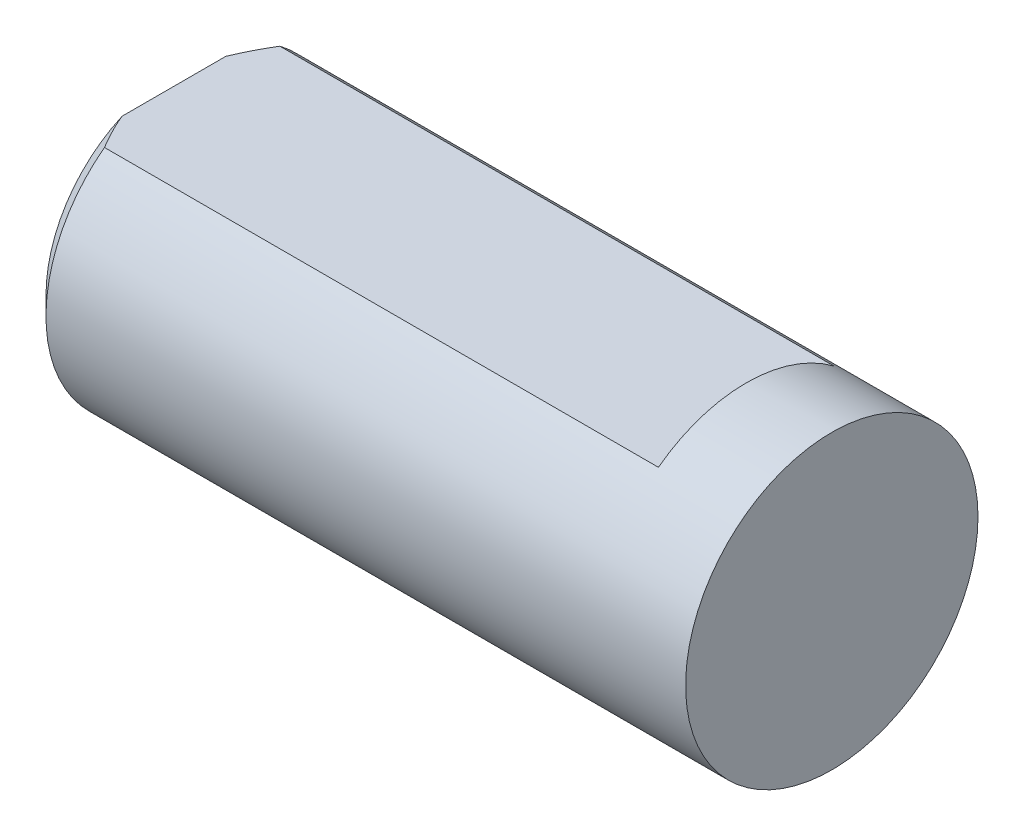
ISO-10303-21;
HEADER;
FILE_DESCRIPTION(('STEP AP214'),'2;1');
FILE_NAME('part.step','',(''),(''),'','','');
FILE_SCHEMA(('AUTOMOTIVE_DESIGN { 1 0 10303 214 1 1 1 1 }'));
ENDSEC;
DATA;
#1=APPLICATION_CONTEXT('core data for automotive mechanical design processes');
#2=APPLICATION_PROTOCOL_DEFINITION('international standard','automotive_design',2000,#1);
#3=PRODUCT_CONTEXT('',#1,'mechanical');
#4=PRODUCT('Part','Part','',(#3));
#5=PRODUCT_RELATED_PRODUCT_CATEGORY('part','',(#4));
#6=PRODUCT_DEFINITION_FORMATION('','',#4);
#7=PRODUCT_DEFINITION_CONTEXT('part definition',#1,'design');
#8=PRODUCT_DEFINITION('design','',#6,#7);
#9=PRODUCT_DEFINITION_SHAPE('','',#8);
#10=(LENGTH_UNIT() NAMED_UNIT(*) SI_UNIT(.MILLI.,.METRE.));
#11=(NAMED_UNIT(*) PLANE_ANGLE_UNIT() SI_UNIT($,.RADIAN.));
#12=(NAMED_UNIT(*) SI_UNIT($,.STERADIAN.) SOLID_ANGLE_UNIT());
#13=UNCERTAINTY_MEASURE_WITH_UNIT(LENGTH_MEASURE(1.E-05),#10,'distance_accuracy_value','');
#14=(GEOMETRIC_REPRESENTATION_CONTEXT(3) GLOBAL_UNCERTAINTY_ASSIGNED_CONTEXT((#13)) GLOBAL_UNIT_ASSIGNED_CONTEXT((#10,
#11,#12)) REPRESENTATION_CONTEXT('',''));
#15=CARTESIAN_POINT('',(0.,0.,0.));
#16=DIRECTION('',(0.,0.,1.));
#17=DIRECTION('',(1.,0.,0.));
#18=AXIS2_PLACEMENT_3D('',#15,#16,#17);
#19=CARTESIAN_POINT('',(0.,4.,0.));
#20=DIRECTION('',(1.,0.,0.));
#21=DIRECTION('',(0.,0.,-1.));
#22=AXIS2_PLACEMENT_3D('',#19,#20,#21);
#23=PLANE('',#22);
#24=CARTESIAN_POINT('',(0.,0.,0.));
#25=DIRECTION('',(1.,0.,0.));
#26=DIRECTION('',(0.,0.,-1.));
#27=AXIS2_PLACEMENT_3D('',#24,#25,#26);
#28=CIRCLE('',#27,4.);
#29=CARTESIAN_POINT('',(0.,0.,-4.));
#30=VERTEX_POINT('',#29);
#31=EDGE_CURVE('E76',#30,#30,#28,.T.);
#32=ORIENTED_EDGE('',*,*,#31,.T.);
#33=EDGE_LOOP('',(#32));
#34=FACE_BOUND('',#33,.T.);
#35=ADVANCED_FACE('F31',(#34),#23,.T.);
#36=CARTESIAN_POINT('',(0.,0.,0.));
#37=DIRECTION('',(1.,0.,0.));
#38=DIRECTION('',(0.,0.,-1.));
#39=AXIS2_PLACEMENT_3D('',#36,#37,#38);
#40=CYLINDRICAL_SURFACE('',#39,4.);
#41=DIRECTION('',(1.,0.,0.));
#42=VECTOR('',#41,1.);
#43=CARTESIAN_POINT('',(0.,3.2,-2.4));
#44=LINE('',#43,#42);
#45=CARTESIAN_POINT('',(-2.34382100606431,3.2,-2.4));
#46=VERTEX_POINT('',#45);
#47=CARTESIAN_POINT('',(-17.5,3.19999999999999,-2.4));
#48=VERTEX_POINT('',#47);
#49=EDGE_CURVE('E51',#46,#48,#44,.F.);
#50=ORIENTED_EDGE('',*,*,#49,.F.);
#51=CARTESIAN_POINT('',(-2.34382100606431,0.,0.));
#52=DIRECTION('',(1.,0.,0.));
#53=DIRECTION('',(0.,1.,0.));
#54=AXIS2_PLACEMENT_3D('',#51,#52,#53);
#55=CIRCLE('',#54,4.);
#56=CARTESIAN_POINT('',(-2.34382100606431,3.2,2.4));
#57=VERTEX_POINT('',#56);
#58=EDGE_CURVE('E11',#57,#46,#55,.F.);
#59=ORIENTED_EDGE('',*,*,#58,.F.);
#60=DIRECTION('',(1.,0.,0.));
#61=VECTOR('',#60,1.);
#62=CARTESIAN_POINT('',(0.,3.2,2.4));
#63=LINE('',#62,#61);
#64=CARTESIAN_POINT('',(-17.5,3.19999999999999,2.4));
#65=VERTEX_POINT('',#64);
#66=EDGE_CURVE('E69',#65,#57,#63,.T.);
#67=ORIENTED_EDGE('',*,*,#66,.F.);
#68=CARTESIAN_POINT('',(-17.5,0.,0.));
#69=DIRECTION('',(-1.,0.,0.));
#70=DIRECTION('',(0.,0.,1.));
#71=AXIS2_PLACEMENT_3D('',#68,#69,#70);
#72=CIRCLE('',#71,4.);
#73=EDGE_CURVE('E75',#65,#48,#72,.F.);
#74=ORIENTED_EDGE('',*,*,#73,.T.);
#75=EDGE_LOOP('',(#50,#59,#67,#74));
#76=FACE_BOUND('',#75,.T.);
#77=ORIENTED_EDGE('',*,*,#31,.F.);
#78=EDGE_LOOP('',(#77));
#79=FACE_BOUND('',#78,.T.);
#80=ADVANCED_FACE('F72',(#76,#79),#40,.T.);
#81=CARTESIAN_POINT('',(-18.,0.,0.));
#82=DIRECTION('',(-1.,0.,0.));
#83=DIRECTION('',(0.,0.,1.));
#84=AXIS2_PLACEMENT_3D('',#81,#82,#83);
#85=PLANE('',#84);
#86=DIRECTION('',(0.,0.,1.));
#87=VECTOR('',#86,1.);
#88=CARTESIAN_POINT('',(-18.,3.19999999999999,0.));
#89=LINE('',#88,#87);
#90=CARTESIAN_POINT('',(-18.,3.19999999999999,-1.41774468787578));
#91=VERTEX_POINT('',#90);
#92=CARTESIAN_POINT('',(-18.,3.19999999999999,1.41774468787578));
#93=VERTEX_POINT('',#92);
#94=EDGE_CURVE('E45',#91,#93,#89,.T.);
#95=ORIENTED_EDGE('',*,*,#94,.F.);
#96=CARTESIAN_POINT('',(-18.,0.,0.));
#97=DIRECTION('',(-1.,0.,0.));
#98=DIRECTION('',(0.,0.,1.));
#99=AXIS2_PLACEMENT_3D('',#96,#97,#98);
#100=CIRCLE('',#99,3.49999999999999);
#101=EDGE_CURVE('E84',#91,#93,#100,.T.);
#102=ORIENTED_EDGE('',*,*,#101,.T.);
#103=EDGE_LOOP('',(#95,#102));
#104=FACE_BOUND('',#103,.T.);
#105=ADVANCED_FACE('F102',(#104),#85,.T.);
#106=CARTESIAN_POINT('',(-17.5,0.,0.));
#107=DIRECTION('',(1.,0.,0.));
#108=DIRECTION('',(0.,0.,-1.));
#109=AXIS2_PLACEMENT_3D('',#106,#107,#108);
#110=CONICAL_SURFACE('',#109,4.,0.785398163397455);
#111=CARTESIAN_POINT('',(-12.6904341374356,3.19999999999999,-8.20782862192318));
#112=CARTESIAN_POINT('',(-12.8072529674133,3.19999999999999,-8.0824433321861));
#113=CARTESIAN_POINT('',(-12.9238850912339,3.19999999999999,-7.95688416463472));
#114=CARTESIAN_POINT('',(-13.1567170737302,3.19999999999999,-7.705364176533));
#115=CARTESIAN_POINT('',(-13.2729169294986,3.19999999999999,-7.57940335329198));
#116=CARTESIAN_POINT('',(-13.6208288629004,3.19999999999999,-7.20078414645644));
#117=CARTESIAN_POINT('',(-13.8518014716849,3.19999999999999,-6.94744455793278));
#118=CARTESIAN_POINT('',(-14.3126214070232,3.19999999999999,-6.43666352553176));
#119=CARTESIAN_POINT('',(-14.542450920677,3.19999999999999,-6.17920598767768));
#120=CARTESIAN_POINT('',(-14.9983275560772,3.19999999999999,-5.66100701874243));
#121=CARTESIAN_POINT('',(-15.2243751594307,3.19999999999999,-5.40026601332121));
#122=CARTESIAN_POINT('',(-15.6263188323111,3.19999999999999,-4.92670994943764));
#123=CARTESIAN_POINT('',(-15.803205030691,3.19999999999999,-4.71473692516114));
#124=CARTESIAN_POINT('',(-16.152092905183,3.19999999999999,-4.28667650527801));
#125=CARTESIAN_POINT('',(-16.3240932083504,3.19999999999999,-4.07058798115392));
#126=CARTESIAN_POINT('',(-16.5765042795092,3.19999999999999,-3.74241039387115));
#127=CARTESIAN_POINT('',(-16.6596504367266,3.19999999999999,-3.63242638359238));
#128=CARTESIAN_POINT('',(-16.8236850076063,3.19999999999999,-3.410790513815));
#129=CARTESIAN_POINT('',(-16.9045735346594,3.19999999999999,-3.29913873851492));
#130=CARTESIAN_POINT('',(-17.0635064892593,3.19999999999999,-3.07389652391093));
#131=CARTESIAN_POINT('',(-17.141552163212,3.19999999999999,-2.96030696706968));
#132=CARTESIAN_POINT('',(-17.2940824575279,3.19999999999999,-2.73076976317204));
#133=CARTESIAN_POINT('',(-17.3685675404463,3.19999999999999,-2.61482242521899));
#134=CARTESIAN_POINT('',(-17.5062289626373,3.19999999999999,-2.39107481239912));
#135=CARTESIAN_POINT('',(-17.5698116368477,3.19999999999999,-2.28352573155724));
#136=CARTESIAN_POINT('',(-17.6922317264686,3.19999999999999,-2.06572396380849));
#137=CARTESIAN_POINT('',(-17.751068626701,3.19999999999999,-1.95547098506928));
#138=CARTESIAN_POINT('',(-17.8626528576987,3.19999999999999,-1.73195498857428));
#139=CARTESIAN_POINT('',(-17.9154026650109,3.19999999999999,-1.61869321818951));
#140=CARTESIAN_POINT('',(-18.0131518922386,3.19999999999999,-1.38885406439301));
#141=CARTESIAN_POINT('',(-18.058153286008,3.19999999999999,-1.2722775342359));
#142=CARTESIAN_POINT('',(-18.1300009366644,3.19999999999999,-1.06048611988069));
#143=CARTESIAN_POINT('',(-18.1586759923217,3.19999999999999,-0.965895419822815));
#144=CARTESIAN_POINT('',(-18.2088182022074,3.19999999999999,-0.774832378049152));
#145=CARTESIAN_POINT('',(-18.2302880111644,3.19999999999999,-0.678360743244729));
#146=CARTESIAN_POINT('',(-18.2649703698051,3.19999999999999,-0.484249974042978));
#147=CARTESIAN_POINT('',(-18.2782098016162,3.19999999999999,-0.386615713424752));
#148=CARTESIAN_POINT('',(-18.2958184697257,3.19999999999999,-0.190543414080719));
#149=CARTESIAN_POINT('',(-18.3001882807057,3.19999999999999,-0.0921054278449551));
#150=CARTESIAN_POINT('',(-18.2997985762963,3.19999999999999,0.105079893156531));
#151=CARTESIAN_POINT('',(-18.2950086664084,3.19999999999999,0.203827168545168));
#152=CARTESIAN_POINT('',(-18.2765246503994,3.19999999999999,0.40047730600507));
#153=CARTESIAN_POINT('',(-18.2628298620931,3.19999999999999,0.498380102800203));
#154=CARTESIAN_POINT('',(-18.2272285286776,3.19999999999999,0.692980424469347));
#155=CARTESIAN_POINT('',(-18.2052961880807,3.19999999999999,0.789673166862277));
#156=CARTESIAN_POINT('',(-18.1542456204611,3.19999999999999,0.981113379763085));
#157=CARTESIAN_POINT('',(-18.1251269744025,3.19999999999999,1.07586073648573));
#158=CARTESIAN_POINT('',(-18.0227313919622,3.19999999999999,1.37419846263081));
#159=CARTESIAN_POINT('',(-17.937982758391,3.19999999999999,1.57387608945513));
#160=CARTESIAN_POINT('',(-17.7965281175516,3.19999999999999,1.86627252531866));
#161=CARTESIAN_POINT('',(-17.7469236599746,3.19999999999999,1.96265638603043));
#162=CARTESIAN_POINT('',(-17.6437940087221,3.19999999999999,2.15330979461302));
#163=CARTESIAN_POINT('',(-17.5902692953249,3.19999999999999,2.24757959963874));
#164=CARTESIAN_POINT('',(-17.4235527430848,3.19999999999999,2.52998500102203));
#165=CARTESIAN_POINT('',(-17.3054719884383,3.19999999999999,2.71522037139923));
#166=CARTESIAN_POINT('',(-17.0608341918686,3.19999999999999,3.07966264637954));
#167=CARTESIAN_POINT('',(-16.9342848656869,3.19999999999999,3.25887482094877));
#168=CARTESIAN_POINT('',(-16.6445919233517,3.19999999999999,3.6547637320759));
#169=CARTESIAN_POINT('',(-16.4798704168947,3.19999999999999,3.87028020727287));
#170=CARTESIAN_POINT('',(-16.1443423347297,3.19999999999999,4.29654053491934));
#171=CARTESIAN_POINT('',(-15.9735346633828,3.19999999999999,4.50728351675525));
#172=CARTESIAN_POINT('',(-15.6274892030576,3.19999999999999,4.92546035069681));
#173=CARTESIAN_POINT('',(-15.4522469607413,3.19999999999999,5.13289050505697));
#174=CARTESIAN_POINT('',(-15.0986743025493,3.19999999999999,5.54510375397033));
#175=CARTESIAN_POINT('',(-14.9203437965455,3.19999999999999,5.74988677096362));
#176=CARTESIAN_POINT('',(-14.5728189791031,3.19999999999999,6.14442664850056));
#177=CARTESIAN_POINT('',(-14.4037670165424,3.19999999999999,6.33430914704845));
#178=CARTESIAN_POINT('',(-14.0640814520539,3.19999999999999,6.71266092774698));
#179=CARTESIAN_POINT('',(-13.8934478111666,3.19999999999999,6.90113017487887));
#180=CARTESIAN_POINT('',(-13.5513182813429,3.19999999999999,7.27650368548922));
#181=CARTESIAN_POINT('',(-13.3798252140453,3.19999999999999,7.46341052382916));
#182=CARTESIAN_POINT('',(-13.0358309645682,3.19999999999999,7.83627770827984));
#183=CARTESIAN_POINT('',(-12.8633298319065,3.19999999999999,8.02223810005575));
#184=CARTESIAN_POINT('',(-12.6904341374356,3.19999999999999,8.20782862192318));
#185=B_SPLINE_CURVE_WITH_KNOTS('',3,(#111,#112,#113,#114,#115,#116,#117,#118,#119,#120,#121,
#122,#123,#124,#125,#126,#127,#128,#129,#130,#131,#132,#133,#134,#135,#136,#137,#138,#139,#140,
#141,#142,#143,#144,#145,#146,#147,#148,#149,#150,#151,#152,#153,#154,#155,#156,#157,#158,#159,
#160,#161,#162,#163,#164,#165,#166,#167,#168,#169,#170,#171,#172,#173,#174,#175,#176,#177,#178,
#179,#180,#181,#182,#183,#184),.UNSPECIFIED.,.F.,.F.,(4,2,2,2,2,2,2,2,2,2,2,2,2,2,2,2,2,2,2,2,2,
2,2,2,2,2,2,2,2,2,2,2,2,2,2,2,4),(0.,0.514113344937449,1.02823014117221,2.05669162353941,
3.09202065471708,4.12721682275116,4.95541814553644,5.78384993714743,6.19745582911073,
6.6110409099353,7.02444242286318,7.43779008417732,7.8125110095121,8.18727255812014,
8.56188109256299,8.93639405647303,9.23268051780456,9.52885769406603,9.82406234007706,
10.1192478585437,10.4154145844968,10.7116040018747,11.0087287612785,11.3058708502286,
11.9547281044057,12.2798936828544,12.6050194910506,13.2636295551523,13.9216475192326,
14.7352434602383,15.5489866131884,16.363582203976,17.1782016081897,17.9408869315909,
18.7035910914203,19.464570872337,20.22551358182),.UNSPECIFIED.);
#186=EDGE_CURVE('E38',#48,#91,#185,.T.);
#187=ORIENTED_EDGE('',*,*,#186,.F.);
#188=ORIENTED_EDGE('',*,*,#73,.F.);
#189=EDGE_CURVE('E86',#93,#65,#185,.T.);
#190=ORIENTED_EDGE('',*,*,#189,.F.);
#191=ORIENTED_EDGE('',*,*,#101,.F.);
#192=EDGE_LOOP('',(#187,#188,#190,#191));
#193=FACE_BOUND('',#192,.T.);
#194=ADVANCED_FACE('F92',(#193),#110,.T.);
#195=CARTESIAN_POINT('',(-2.34382100606431,12.9026688917585,-4.));
#196=DIRECTION('',(1.,0.,0.));
#197=DIRECTION('',(0.,1.,0.));
#198=AXIS2_PLACEMENT_3D('',#195,#196,#197);
#199=PLANE('',#198);
#200=ORIENTED_EDGE('',*,*,#58,.T.);
#201=DIRECTION('',(0.,0.,1.));
#202=VECTOR('',#201,1.);
#203=CARTESIAN_POINT('',(-2.34382100606431,3.2,-4.));
#204=LINE('',#203,#202);
#205=EDGE_CURVE('E65',#46,#57,#204,.T.);
#206=ORIENTED_EDGE('',*,*,#205,.T.);
#207=EDGE_LOOP('',(#200,#206));
#208=FACE_BOUND('',#207,.T.);
#209=ADVANCED_FACE('F64',(#208),#199,.F.);
#210=CARTESIAN_POINT('',(-2.34382100606431,3.2,-4.));
#211=DIRECTION('',(0.,-1.,0.));
#212=DIRECTION('',(1.,0.,0.));
#213=AXIS2_PLACEMENT_3D('',#210,#211,#212);
#214=PLANE('',#213);
#215=ORIENTED_EDGE('',*,*,#49,.T.);
#216=ORIENTED_EDGE('',*,*,#186,.T.);
#217=ORIENTED_EDGE('',*,*,#94,.T.);
#218=ORIENTED_EDGE('',*,*,#189,.T.);
#219=ORIENTED_EDGE('',*,*,#66,.T.);
#220=ORIENTED_EDGE('',*,*,#205,.F.);
#221=EDGE_LOOP('',(#215,#216,#217,#218,#219,#220));
#222=FACE_BOUND('',#221,.T.);
#223=ADVANCED_FACE('F68',(#222),#214,.F.);
#224=CLOSED_SHELL('',(#35,#80,#105,#194,#209,#223));
#225=MANIFOLD_SOLID_BREP('B2',#224);
#226=ADVANCED_BREP_SHAPE_REPRESENTATION('',(#18,#225),#14);
#227=SHAPE_DEFINITION_REPRESENTATION(#9,#226);
ENDSEC;
END-ISO-10303-21;
